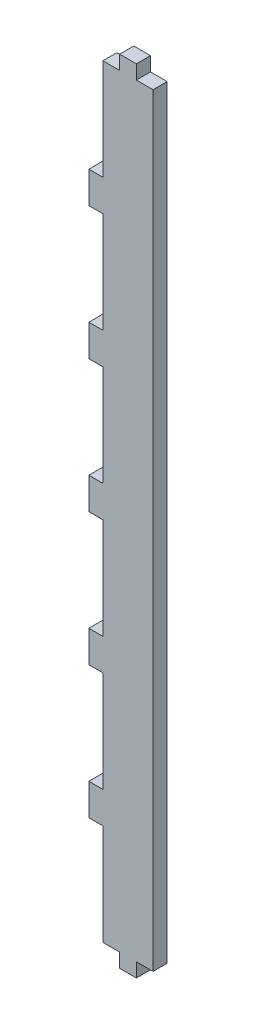
ISO-10303-21;
HEADER;
FILE_DESCRIPTION(('STEP AP214'),'2;1');
FILE_NAME('part.step','',(''),(''),'','','');
FILE_SCHEMA(('AUTOMOTIVE_DESIGN { 1 0 10303 214 1 1 1 1 }'));
ENDSEC;
DATA;
#1=APPLICATION_CONTEXT('core data for automotive mechanical design processes');
#2=APPLICATION_PROTOCOL_DEFINITION('international standard','automotive_design',2000,#1);
#3=PRODUCT_CONTEXT('',#1,'mechanical');
#4=PRODUCT('Part','Part','',(#3));
#5=PRODUCT_RELATED_PRODUCT_CATEGORY('part','',(#4));
#6=PRODUCT_DEFINITION_FORMATION('','',#4);
#7=PRODUCT_DEFINITION_CONTEXT('part definition',#1,'design');
#8=PRODUCT_DEFINITION('design','',#6,#7);
#9=PRODUCT_DEFINITION_SHAPE('','',#8);
#10=(LENGTH_UNIT() NAMED_UNIT(*) SI_UNIT(.MILLI.,.METRE.));
#11=(NAMED_UNIT(*) PLANE_ANGLE_UNIT() SI_UNIT($,.RADIAN.));
#12=(NAMED_UNIT(*) SI_UNIT($,.STERADIAN.) SOLID_ANGLE_UNIT());
#13=UNCERTAINTY_MEASURE_WITH_UNIT(LENGTH_MEASURE(1.E-05),#10,'distance_accuracy_value','');
#14=(GEOMETRIC_REPRESENTATION_CONTEXT(3) GLOBAL_UNCERTAINTY_ASSIGNED_CONTEXT((#13)) GLOBAL_UNIT_ASSIGNED_CONTEXT((#10,
#11,#12)) REPRESENTATION_CONTEXT('',''));
#15=CARTESIAN_POINT('',(0.,0.,0.));
#16=DIRECTION('',(0.,0.,1.));
#17=DIRECTION('',(1.,0.,0.));
#18=AXIS2_PLACEMENT_3D('',#15,#16,#17);
#19=CARTESIAN_POINT('',(24.4000004605,5.3499937057,5.35));
#20=DIRECTION('',(-1.,0.,0.));
#21=DIRECTION('',(0.,0.,1.));
#22=AXIS2_PLACEMENT_3D('',#19,#20,#21);
#23=PLANE('',#22);
#24=DIRECTION('',(0.,1.,0.));
#25=VECTOR('',#24,1.);
#26=CARTESIAN_POINT('',(24.4000004605,5.3499937057,0.));
#27=LINE('',#26,#25);
#28=CARTESIAN_POINT('',(24.4000004605,5.3499937057,0.));
#29=VERTEX_POINT('',#28);
#30=CARTESIAN_POINT('',(24.4000004605,295.3500039875,0.));
#31=VERTEX_POINT('',#30);
#32=EDGE_CURVE('E273',#29,#31,#27,.T.);
#33=ORIENTED_EDGE('',*,*,#32,.T.);
#34=DIRECTION('',(0.,0.,-1.));
#35=VECTOR('',#34,1.);
#36=CARTESIAN_POINT('',(24.4000004605,295.3500039875,5.35));
#37=LINE('',#36,#35);
#38=CARTESIAN_POINT('',(24.4000004605,295.3500039875,5.35));
#39=VERTEX_POINT('',#38);
#40=EDGE_CURVE('E11',#39,#31,#37,.T.);
#41=ORIENTED_EDGE('',*,*,#40,.F.);
#42=DIRECTION('',(0.,1.,0.));
#43=VECTOR('',#42,1.);
#44=CARTESIAN_POINT('',(24.4000004605,5.3499937057,5.35));
#45=LINE('',#44,#43);
#46=CARTESIAN_POINT('',(24.4000004605,5.3499937057,5.35));
#47=VERTEX_POINT('',#46);
#48=EDGE_CURVE('E335',#47,#39,#45,.T.);
#49=ORIENTED_EDGE('',*,*,#48,.F.);
#50=DIRECTION('',(0.,0.,-1.));
#51=VECTOR('',#50,1.);
#52=CARTESIAN_POINT('',(24.4000004605,5.3499937057,5.35));
#53=LINE('',#52,#51);
#54=EDGE_CURVE('E269',#47,#29,#53,.T.);
#55=ORIENTED_EDGE('',*,*,#54,.T.);
#56=EDGE_LOOP('',(#33,#41,#49,#55));
#57=FACE_BOUND('',#56,.T.);
#58=ADVANCED_FACE('F33',(#57),#23,.F.);
#59=CARTESIAN_POINT('',(24.4000004605,295.3500039875,5.35));
#60=DIRECTION('',(0.,-1.,0.));
#61=DIRECTION('',(0.,0.,-1.));
#62=AXIS2_PLACEMENT_3D('',#59,#60,#61);
#63=PLANE('',#62);
#64=DIRECTION('',(-1.,0.,0.));
#65=VECTOR('',#64,1.);
#66=CARTESIAN_POINT('',(24.4000004605,295.3500039875,0.));
#67=LINE('',#66,#65);
#68=CARTESIAN_POINT('',(18.0500000716,295.3500039875,0.));
#69=VERTEX_POINT('',#68);
#70=EDGE_CURVE('E276',#31,#69,#67,.T.);
#71=ORIENTED_EDGE('',*,*,#70,.T.);
#72=DIRECTION('',(0.,0.,-1.));
#73=VECTOR('',#72,1.);
#74=CARTESIAN_POINT('',(18.0500000716,295.3500039875,5.35));
#75=LINE('',#74,#73);
#76=CARTESIAN_POINT('',(18.0500000716,295.3500039875,5.35));
#77=VERTEX_POINT('',#76);
#78=EDGE_CURVE('E41',#77,#69,#75,.T.);
#79=ORIENTED_EDGE('',*,*,#78,.F.);
#80=DIRECTION('',(-1.,0.,0.));
#81=VECTOR('',#80,1.);
#82=CARTESIAN_POINT('',(24.4000004605,295.3500039875,5.35));
#83=LINE('',#82,#81);
#84=EDGE_CURVE('E164',#39,#77,#83,.T.);
#85=ORIENTED_EDGE('',*,*,#84,.F.);
#86=ORIENTED_EDGE('',*,*,#40,.T.);
#87=EDGE_LOOP('',(#71,#79,#85,#86));
#88=FACE_BOUND('',#87,.T.);
#89=ADVANCED_FACE('F513',(#88),#63,.F.);
#90=CARTESIAN_POINT('',(18.0500000716,295.3500039875,5.35));
#91=DIRECTION('',(-1.,0.,0.));
#92=DIRECTION('',(0.,0.,1.));
#93=AXIS2_PLACEMENT_3D('',#90,#91,#92);
#94=PLANE('',#93);
#95=DIRECTION('',(0.,1.,0.));
#96=VECTOR('',#95,1.);
#97=CARTESIAN_POINT('',(18.0500000716,295.3500039875,0.));
#98=LINE('',#97,#96);
#99=CARTESIAN_POINT('',(18.0500000716,300.7000051439,0.));
#100=VERTEX_POINT('',#99);
#101=EDGE_CURVE('E278',#69,#100,#98,.T.);
#102=ORIENTED_EDGE('',*,*,#101,.T.);
#103=DIRECTION('',(0.,0.,-1.));
#104=VECTOR('',#103,1.);
#105=CARTESIAN_POINT('',(18.0500000716,300.7000051439,5.35));
#106=LINE('',#105,#104);
#107=CARTESIAN_POINT('',(18.0500000716,300.7000051439,5.35));
#108=VERTEX_POINT('',#107);
#109=EDGE_CURVE('E414',#108,#100,#106,.T.);
#110=ORIENTED_EDGE('',*,*,#109,.F.);
#111=DIRECTION('',(0.,1.,0.));
#112=VECTOR('',#111,1.);
#113=CARTESIAN_POINT('',(18.0500000716,295.3500039875,5.35));
#114=LINE('',#113,#112);
#115=EDGE_CURVE('E422',#77,#108,#114,.T.);
#116=ORIENTED_EDGE('',*,*,#115,.F.);
#117=ORIENTED_EDGE('',*,*,#78,.T.);
#118=EDGE_LOOP('',(#102,#110,#116,#117));
#119=FACE_BOUND('',#118,.T.);
#120=ADVANCED_FACE('F420',(#119),#94,.F.);
#121=CARTESIAN_POINT('',(18.0500000716,300.7000051439,5.35));
#122=DIRECTION('',(0.,-1.,0.));
#123=DIRECTION('',(0.,0.,-1.));
#124=AXIS2_PLACEMENT_3D('',#121,#122,#123);
#125=PLANE('',#124);
#126=DIRECTION('',(-1.,0.,0.));
#127=VECTOR('',#126,1.);
#128=CARTESIAN_POINT('',(18.0500000716,300.7000051439,0.));
#129=LINE('',#128,#127);
#130=CARTESIAN_POINT('',(11.7000001483,300.7000051439,0.));
#131=VERTEX_POINT('',#130);
#132=EDGE_CURVE('E280',#100,#131,#129,.T.);
#133=ORIENTED_EDGE('',*,*,#132,.T.);
#134=DIRECTION('',(0.,0.,-1.));
#135=VECTOR('',#134,1.);
#136=CARTESIAN_POINT('',(11.7000001483,300.7000051439,5.35));
#137=LINE('',#136,#135);
#138=CARTESIAN_POINT('',(11.7000001483,300.7000051439,5.35));
#139=VERTEX_POINT('',#138);
#140=EDGE_CURVE('E411',#139,#131,#137,.T.);
#141=ORIENTED_EDGE('',*,*,#140,.F.);
#142=DIRECTION('',(-1.,0.,0.));
#143=VECTOR('',#142,1.);
#144=CARTESIAN_POINT('',(18.0500000716,300.7000051439,5.35));
#145=LINE('',#144,#143);
#146=EDGE_CURVE('E440',#108,#139,#145,.T.);
#147=ORIENTED_EDGE('',*,*,#146,.F.);
#148=ORIENTED_EDGE('',*,*,#109,.T.);
#149=EDGE_LOOP('',(#133,#141,#147,#148));
#150=FACE_BOUND('',#149,.T.);
#151=ADVANCED_FACE('F431',(#150),#125,.F.);
#152=CARTESIAN_POINT('',(11.7000001483,300.7000051439,5.35));
#153=DIRECTION('',(1.,0.,0.));
#154=DIRECTION('',(0.,0.,-1.));
#155=AXIS2_PLACEMENT_3D('',#152,#153,#154);
#156=PLANE('',#155);
#157=DIRECTION('',(0.,-1.,0.));
#158=VECTOR('',#157,1.);
#159=CARTESIAN_POINT('',(11.7000001483,300.7000051439,0.));
#160=LINE('',#159,#158);
#161=CARTESIAN_POINT('',(11.7000001483,295.3500039875,0.));
#162=VERTEX_POINT('',#161);
#163=EDGE_CURVE('E282',#131,#162,#160,.T.);
#164=ORIENTED_EDGE('',*,*,#163,.T.);
#165=DIRECTION('',(0.,0.,-1.));
#166=VECTOR('',#165,1.);
#167=CARTESIAN_POINT('',(11.7000001483,295.3500039875,5.35));
#168=LINE('',#167,#166);
#169=CARTESIAN_POINT('',(11.7000001483,295.3500039875,5.35));
#170=VERTEX_POINT('',#169);
#171=EDGE_CURVE('E408',#170,#162,#168,.T.);
#172=ORIENTED_EDGE('',*,*,#171,.F.);
#173=DIRECTION('',(0.,-1.,0.));
#174=VECTOR('',#173,1.);
#175=CARTESIAN_POINT('',(11.7000001483,300.7000051439,5.35));
#176=LINE('',#175,#174);
#177=EDGE_CURVE('E437',#139,#170,#176,.T.);
#178=ORIENTED_EDGE('',*,*,#177,.F.);
#179=ORIENTED_EDGE('',*,*,#140,.T.);
#180=EDGE_LOOP('',(#164,#172,#178,#179));
#181=FACE_BOUND('',#180,.T.);
#182=ADVANCED_FACE('F435',(#181),#156,.F.);
#183=CARTESIAN_POINT('',(11.7000001483,295.3500039875,5.35));
#184=DIRECTION('',(0.,-1.,0.));
#185=DIRECTION('',(0.,0.,-1.));
#186=AXIS2_PLACEMENT_3D('',#183,#184,#185);
#187=PLANE('',#186);
#188=DIRECTION('',(-1.,0.,0.));
#189=VECTOR('',#188,1.);
#190=CARTESIAN_POINT('',(11.7000001483,295.3500039875,0.));
#191=LINE('',#190,#189);
#192=CARTESIAN_POINT('',(5.35000022509999,295.3500039875,0.));
#193=VERTEX_POINT('',#192);
#194=EDGE_CURVE('E284',#162,#193,#191,.T.);
#195=ORIENTED_EDGE('',*,*,#194,.T.);
#196=DIRECTION('',(0.,0.,-1.));
#197=VECTOR('',#196,1.);
#198=CARTESIAN_POINT('',(5.35000022509999,295.3500039875,5.35));
#199=LINE('',#198,#197);
#200=CARTESIAN_POINT('',(5.35000022509999,295.3500039875,5.35));
#201=VERTEX_POINT('',#200);
#202=EDGE_CURVE('E405',#201,#193,#199,.T.);
#203=ORIENTED_EDGE('',*,*,#202,.F.);
#204=DIRECTION('',(-1.,0.,0.));
#205=VECTOR('',#204,1.);
#206=CARTESIAN_POINT('',(11.7000001483,295.3500039875,5.35));
#207=LINE('',#206,#205);
#208=EDGE_CURVE('E439',#170,#201,#207,.T.);
#209=ORIENTED_EDGE('',*,*,#208,.F.);
#210=ORIENTED_EDGE('',*,*,#171,.T.);
#211=EDGE_LOOP('',(#195,#203,#209,#210));
#212=FACE_BOUND('',#211,.T.);
#213=ADVANCED_FACE('F526',(#212),#187,.F.);
#214=CARTESIAN_POINT('',(5.35000022509999,295.3500039875,5.35));
#215=DIRECTION('',(1.,0.,0.));
#216=DIRECTION('',(0.,0.,-1.));
#217=AXIS2_PLACEMENT_3D('',#214,#215,#216);
#218=PLANE('',#217);
#219=DIRECTION('',(0.,-1.,0.));
#220=VECTOR('',#219,1.);
#221=CARTESIAN_POINT('',(5.35000022509999,295.3500039875,0.));
#222=LINE('',#221,#220);
#223=CARTESIAN_POINT('',(5.35000022509999,257.0166713558,0.));
#224=VERTEX_POINT('',#223);
#225=EDGE_CURVE('E286',#193,#224,#222,.T.);
#226=ORIENTED_EDGE('',*,*,#225,.T.);
#227=DIRECTION('',(0.,0.,-1.));
#228=VECTOR('',#227,1.);
#229=CARTESIAN_POINT('',(5.35000022509999,257.0166713558,5.35));
#230=LINE('',#229,#228);
#231=CARTESIAN_POINT('',(5.35000022509999,257.0166713558,5.35));
#232=VERTEX_POINT('',#231);
#233=EDGE_CURVE('E402',#232,#224,#230,.T.);
#234=ORIENTED_EDGE('',*,*,#233,.F.);
#235=DIRECTION('',(0.,-1.,0.));
#236=VECTOR('',#235,1.);
#237=CARTESIAN_POINT('',(5.35000022509999,295.3500039875,5.35));
#238=LINE('',#237,#236);
#239=EDGE_CURVE('E442',#201,#232,#238,.T.);
#240=ORIENTED_EDGE('',*,*,#239,.F.);
#241=ORIENTED_EDGE('',*,*,#202,.T.);
#242=EDGE_LOOP('',(#226,#234,#240,#241));
#243=FACE_BOUND('',#242,.T.);
#244=ADVANCED_FACE('F529',(#243),#218,.F.);
#245=CARTESIAN_POINT('',(5.35000022509999,257.0166713558,5.35));
#246=DIRECTION('',(0.,-1.,0.));
#247=DIRECTION('',(0.,0.,-1.));
#248=AXIS2_PLACEMENT_3D('',#245,#246,#247);
#249=PLANE('',#248);
#250=DIRECTION('',(-1.,0.,0.));
#251=VECTOR('',#250,1.);
#252=CARTESIAN_POINT('',(5.35000022509999,257.0166713558,0.));
#253=LINE('',#252,#251);
#254=CARTESIAN_POINT('',(0.,257.0166713558,0.));
#255=VERTEX_POINT('',#254);
#256=EDGE_CURVE('E288',#224,#255,#253,.T.);
#257=ORIENTED_EDGE('',*,*,#256,.T.);
#258=DIRECTION('',(0.,0.,-1.));
#259=VECTOR('',#258,1.);
#260=CARTESIAN_POINT('',(0.,257.0166713558,5.35));
#261=LINE('',#260,#259);
#262=CARTESIAN_POINT('',(0.,257.0166713558,5.35));
#263=VERTEX_POINT('',#262);
#264=EDGE_CURVE('E399',#263,#255,#261,.T.);
#265=ORIENTED_EDGE('',*,*,#264,.F.);
#266=DIRECTION('',(-1.,0.,0.));
#267=VECTOR('',#266,1.);
#268=CARTESIAN_POINT('',(5.35000022509999,257.0166713558,5.35));
#269=LINE('',#268,#267);
#270=EDGE_CURVE('E448',#232,#263,#269,.T.);
#271=ORIENTED_EDGE('',*,*,#270,.F.);
#272=ORIENTED_EDGE('',*,*,#233,.T.);
#273=EDGE_LOOP('',(#257,#265,#271,#272));
#274=FACE_BOUND('',#273,.T.);
#275=ADVANCED_FACE('F533',(#274),#249,.F.);
#276=CARTESIAN_POINT('',(0.,257.0166713558,5.35));
#277=DIRECTION('',(1.,0.,0.));
#278=DIRECTION('',(0.,0.,-1.));
#279=AXIS2_PLACEMENT_3D('',#276,#277,#278);
#280=PLANE('',#279);
#281=DIRECTION('',(0.,-1.,0.));
#282=VECTOR('',#281,1.);
#283=CARTESIAN_POINT('',(0.,257.0166713558,0.));
#284=LINE('',#283,#282);
#285=CARTESIAN_POINT('',(0.,245.0166717172,0.));
#286=VERTEX_POINT('',#285);
#287=EDGE_CURVE('E290',#255,#286,#284,.T.);
#288=ORIENTED_EDGE('',*,*,#287,.T.);
#289=DIRECTION('',(0.,0.,-1.));
#290=VECTOR('',#289,1.);
#291=CARTESIAN_POINT('',(0.,245.0166717172,5.35));
#292=LINE('',#291,#290);
#293=CARTESIAN_POINT('',(0.,245.0166717172,5.35));
#294=VERTEX_POINT('',#293);
#295=EDGE_CURVE('E396',#294,#286,#292,.T.);
#296=ORIENTED_EDGE('',*,*,#295,.F.);
#297=DIRECTION('',(0.,-1.,0.));
#298=VECTOR('',#297,1.);
#299=CARTESIAN_POINT('',(0.,257.0166713558,5.35));
#300=LINE('',#299,#298);
#301=EDGE_CURVE('E450',#263,#294,#300,.T.);
#302=ORIENTED_EDGE('',*,*,#301,.F.);
#303=ORIENTED_EDGE('',*,*,#264,.T.);
#304=EDGE_LOOP('',(#288,#296,#302,#303));
#305=FACE_BOUND('',#304,.T.);
#306=ADVANCED_FACE('F537',(#305),#280,.F.);
#307=CARTESIAN_POINT('',(0.,245.0166717172,5.35));
#308=DIRECTION('',(0.,1.,0.));
#309=DIRECTION('',(0.,0.,1.));
#310=AXIS2_PLACEMENT_3D('',#307,#308,#309);
#311=PLANE('',#310);
#312=DIRECTION('',(1.,0.,0.));
#313=VECTOR('',#312,1.);
#314=CARTESIAN_POINT('',(0.,245.0166717172,0.));
#315=LINE('',#314,#313);
#316=CARTESIAN_POINT('',(5.35000022509999,245.0166717172,0.));
#317=VERTEX_POINT('',#316);
#318=EDGE_CURVE('E292',#286,#317,#315,.T.);
#319=ORIENTED_EDGE('',*,*,#318,.T.);
#320=DIRECTION('',(0.,0.,-1.));
#321=VECTOR('',#320,1.);
#322=CARTESIAN_POINT('',(5.35000022509999,245.0166717172,5.35));
#323=LINE('',#322,#321);
#324=CARTESIAN_POINT('',(5.35000022509999,245.0166717172,5.35));
#325=VERTEX_POINT('',#324);
#326=EDGE_CURVE('E393',#325,#317,#323,.T.);
#327=ORIENTED_EDGE('',*,*,#326,.F.);
#328=DIRECTION('',(1.,0.,0.));
#329=VECTOR('',#328,1.);
#330=CARTESIAN_POINT('',(0.,245.0166717172,5.35));
#331=LINE('',#330,#329);
#332=EDGE_CURVE('E452',#294,#325,#331,.T.);
#333=ORIENTED_EDGE('',*,*,#332,.F.);
#334=ORIENTED_EDGE('',*,*,#295,.T.);
#335=EDGE_LOOP('',(#319,#327,#333,#334));
#336=FACE_BOUND('',#335,.T.);
#337=ADVANCED_FACE('F541',(#336),#311,.F.);
#338=CARTESIAN_POINT('',(5.35000022509999,245.0166717172,5.35));
#339=DIRECTION('',(1.,0.,0.));
#340=DIRECTION('',(0.,0.,-1.));
#341=AXIS2_PLACEMENT_3D('',#338,#339,#340);
#342=PLANE('',#341);
#343=DIRECTION('',(0.,-1.,0.));
#344=VECTOR('',#343,1.);
#345=CARTESIAN_POINT('',(5.35000022509999,245.0166717172,0.));
#346=LINE('',#345,#344);
#347=CARTESIAN_POINT('',(5.35000022509999,206.6833376884,0.));
#348=VERTEX_POINT('',#347);
#349=EDGE_CURVE('E294',#317,#348,#346,.T.);
#350=ORIENTED_EDGE('',*,*,#349,.T.);
#351=DIRECTION('',(0.,0.,-1.));
#352=VECTOR('',#351,1.);
#353=CARTESIAN_POINT('',(5.35000022509999,206.6833376884,5.35));
#354=LINE('',#353,#352);
#355=CARTESIAN_POINT('',(5.35000022509999,206.6833376884,5.35));
#356=VERTEX_POINT('',#355);
#357=EDGE_CURVE('E390',#356,#348,#354,.T.);
#358=ORIENTED_EDGE('',*,*,#357,.F.);
#359=DIRECTION('',(0.,-1.,0.));
#360=VECTOR('',#359,1.);
#361=CARTESIAN_POINT('',(5.35000022509999,245.0166717172,5.35));
#362=LINE('',#361,#360);
#363=EDGE_CURVE('E454',#325,#356,#362,.T.);
#364=ORIENTED_EDGE('',*,*,#363,.F.);
#365=ORIENTED_EDGE('',*,*,#326,.T.);
#366=EDGE_LOOP('',(#350,#358,#364,#365));
#367=FACE_BOUND('',#366,.T.);
#368=ADVANCED_FACE('F545',(#367),#342,.F.);
#369=CARTESIAN_POINT('',(5.35000022509999,206.6833376884,5.35));
#370=DIRECTION('',(0.,-1.,0.));
#371=DIRECTION('',(0.,0.,-1.));
#372=AXIS2_PLACEMENT_3D('',#369,#370,#371);
#373=PLANE('',#372);
#374=DIRECTION('',(-1.,0.,0.));
#375=VECTOR('',#374,1.);
#376=CARTESIAN_POINT('',(5.35000022509999,206.6833376884,0.));
#377=LINE('',#376,#375);
#378=CARTESIAN_POINT('',(0.,206.6833376884,0.));
#379=VERTEX_POINT('',#378);
#380=EDGE_CURVE('E296',#348,#379,#377,.T.);
#381=ORIENTED_EDGE('',*,*,#380,.T.);
#382=DIRECTION('',(0.,0.,-1.));
#383=VECTOR('',#382,1.);
#384=CARTESIAN_POINT('',(0.,206.6833376884,5.35));
#385=LINE('',#384,#383);
#386=CARTESIAN_POINT('',(0.,206.6833376884,5.35));
#387=VERTEX_POINT('',#386);
#388=EDGE_CURVE('E387',#387,#379,#385,.T.);
#389=ORIENTED_EDGE('',*,*,#388,.F.);
#390=DIRECTION('',(-1.,0.,0.));
#391=VECTOR('',#390,1.);
#392=CARTESIAN_POINT('',(5.35000022509999,206.6833376884,5.35));
#393=LINE('',#392,#391);
#394=EDGE_CURVE('E456',#356,#387,#393,.T.);
#395=ORIENTED_EDGE('',*,*,#394,.F.);
#396=ORIENTED_EDGE('',*,*,#357,.T.);
#397=EDGE_LOOP('',(#381,#389,#395,#396));
#398=FACE_BOUND('',#397,.T.);
#399=ADVANCED_FACE('F549',(#398),#373,.F.);
#400=CARTESIAN_POINT('',(0.,206.6833376884,5.35));
#401=DIRECTION('',(1.,0.,0.));
#402=DIRECTION('',(0.,0.,-1.));
#403=AXIS2_PLACEMENT_3D('',#400,#401,#402);
#404=PLANE('',#403);
#405=DIRECTION('',(0.,-1.,0.));
#406=VECTOR('',#405,1.);
#407=CARTESIAN_POINT('',(0.,206.6833376884,0.));
#408=LINE('',#407,#406);
#409=CARTESIAN_POINT('',(0.,194.6833357215,0.));
#410=VERTEX_POINT('',#409);
#411=EDGE_CURVE('E298',#379,#410,#408,.T.);
#412=ORIENTED_EDGE('',*,*,#411,.T.);
#413=DIRECTION('',(0.,0.,-1.));
#414=VECTOR('',#413,1.);
#415=CARTESIAN_POINT('',(0.,194.6833357215,5.35));
#416=LINE('',#415,#414);
#417=CARTESIAN_POINT('',(0.,194.6833357215,5.35));
#418=VERTEX_POINT('',#417);
#419=EDGE_CURVE('E384',#418,#410,#416,.T.);
#420=ORIENTED_EDGE('',*,*,#419,.F.);
#421=DIRECTION('',(0.,-1.,0.));
#422=VECTOR('',#421,1.);
#423=CARTESIAN_POINT('',(0.,206.6833376884,5.35));
#424=LINE('',#423,#422);
#425=EDGE_CURVE('E458',#387,#418,#424,.T.);
#426=ORIENTED_EDGE('',*,*,#425,.F.);
#427=ORIENTED_EDGE('',*,*,#388,.T.);
#428=EDGE_LOOP('',(#412,#420,#426,#427));
#429=FACE_BOUND('',#428,.T.);
#430=ADVANCED_FACE('F553',(#429),#404,.F.);
#431=CARTESIAN_POINT('',(0.,194.6833357215,5.35));
#432=DIRECTION('',(0.,1.,0.));
#433=DIRECTION('',(0.,0.,1.));
#434=AXIS2_PLACEMENT_3D('',#431,#432,#433);
#435=PLANE('',#434);
#436=DIRECTION('',(1.,0.,0.));
#437=VECTOR('',#436,1.);
#438=CARTESIAN_POINT('',(0.,194.6833357215,0.));
#439=LINE('',#438,#437);
#440=CARTESIAN_POINT('',(5.35000022509999,194.6833357215,0.));
#441=VERTEX_POINT('',#440);
#442=EDGE_CURVE('E300',#410,#441,#439,.T.);
#443=ORIENTED_EDGE('',*,*,#442,.T.);
#444=DIRECTION('',(0.,0.,-1.));
#445=VECTOR('',#444,1.);
#446=CARTESIAN_POINT('',(5.35000022509999,194.6833357215,5.35));
#447=LINE('',#446,#445);
#448=CARTESIAN_POINT('',(5.35000022509999,194.6833357215,5.35));
#449=VERTEX_POINT('',#448);
#450=EDGE_CURVE('E381',#449,#441,#447,.T.);
#451=ORIENTED_EDGE('',*,*,#450,.F.);
#452=DIRECTION('',(1.,0.,0.));
#453=VECTOR('',#452,1.);
#454=CARTESIAN_POINT('',(0.,194.6833357215,5.35));
#455=LINE('',#454,#453);
#456=EDGE_CURVE('E460',#418,#449,#455,.T.);
#457=ORIENTED_EDGE('',*,*,#456,.F.);
#458=ORIENTED_EDGE('',*,*,#419,.T.);
#459=EDGE_LOOP('',(#443,#451,#457,#458));
#460=FACE_BOUND('',#459,.T.);
#461=ADVANCED_FACE('F557',(#460),#435,.F.);
#462=CARTESIAN_POINT('',(5.35000022509999,194.6833357215,5.35));
#463=DIRECTION('',(1.,0.,0.));
#464=DIRECTION('',(0.,0.,-1.));
#465=AXIS2_PLACEMENT_3D('',#462,#463,#464);
#466=PLANE('',#465);
#467=DIRECTION('',(0.,-1.,0.));
#468=VECTOR('',#467,1.);
#469=CARTESIAN_POINT('',(5.35000022509999,194.6833357215,0.));
#470=LINE('',#469,#468);
#471=CARTESIAN_POINT('',(5.35000022509999,156.3500016928,0.));
#472=VERTEX_POINT('',#471);
#473=EDGE_CURVE('E302',#441,#472,#470,.T.);
#474=ORIENTED_EDGE('',*,*,#473,.T.);
#475=DIRECTION('',(0.,0.,-1.));
#476=VECTOR('',#475,1.);
#477=CARTESIAN_POINT('',(5.35000022509999,156.3500016928,5.35));
#478=LINE('',#477,#476);
#479=CARTESIAN_POINT('',(5.35000022509999,156.3500016928,5.35));
#480=VERTEX_POINT('',#479);
#481=EDGE_CURVE('E378',#480,#472,#478,.T.);
#482=ORIENTED_EDGE('',*,*,#481,.F.);
#483=DIRECTION('',(0.,-1.,0.));
#484=VECTOR('',#483,1.);
#485=CARTESIAN_POINT('',(5.35000022509999,194.6833357215,5.35));
#486=LINE('',#485,#484);
#487=EDGE_CURVE('E462',#449,#480,#486,.T.);
#488=ORIENTED_EDGE('',*,*,#487,.F.);
#489=ORIENTED_EDGE('',*,*,#450,.T.);
#490=EDGE_LOOP('',(#474,#482,#488,#489));
#491=FACE_BOUND('',#490,.T.);
#492=ADVANCED_FACE('F561',(#491),#466,.F.);
#493=CARTESIAN_POINT('',(5.35000022509999,156.3500016928,5.35));
#494=DIRECTION('',(0.,-1.,0.));
#495=DIRECTION('',(0.,0.,-1.));
#496=AXIS2_PLACEMENT_3D('',#493,#494,#495);
#497=PLANE('',#496);
#498=DIRECTION('',(-1.,0.,0.));
#499=VECTOR('',#498,1.);
#500=CARTESIAN_POINT('',(5.35000022509999,156.3500016928,0.));
#501=LINE('',#500,#499);
#502=CARTESIAN_POINT('',(0.,156.3500016928,0.));
#503=VERTEX_POINT('',#502);
#504=EDGE_CURVE('E304',#472,#503,#501,.T.);
#505=ORIENTED_EDGE('',*,*,#504,.T.);
#506=DIRECTION('',(0.,0.,-1.));
#507=VECTOR('',#506,1.);
#508=CARTESIAN_POINT('',(0.,156.3500016928,5.35));
#509=LINE('',#508,#507);
#510=CARTESIAN_POINT('',(0.,156.3500016928,5.35));
#511=VERTEX_POINT('',#510);
#512=EDGE_CURVE('E375',#511,#503,#509,.T.);
#513=ORIENTED_EDGE('',*,*,#512,.F.);
#514=DIRECTION('',(-1.,0.,0.));
#515=VECTOR('',#514,1.);
#516=CARTESIAN_POINT('',(5.35000022509999,156.3500016928,5.35));
#517=LINE('',#516,#515);
#518=EDGE_CURVE('E464',#480,#511,#517,.T.);
#519=ORIENTED_EDGE('',*,*,#518,.F.);
#520=ORIENTED_EDGE('',*,*,#481,.T.);
#521=EDGE_LOOP('',(#505,#513,#519,#520));
#522=FACE_BOUND('',#521,.T.);
#523=ADVANCED_FACE('F565',(#522),#497,.F.);
#524=CARTESIAN_POINT('',(0.,156.3500016928,5.35));
#525=DIRECTION('',(1.,0.,0.));
#526=DIRECTION('',(0.,0.,-1.));
#527=AXIS2_PLACEMENT_3D('',#524,#525,#526);
#528=PLANE('',#527);
#529=DIRECTION('',(0.,-1.,0.));
#530=VECTOR('',#529,1.);
#531=CARTESIAN_POINT('',(0.,156.3500016928,0.));
#532=LINE('',#531,#530);
#533=CARTESIAN_POINT('',(0.,144.3500071764,0.));
#534=VERTEX_POINT('',#533);
#535=EDGE_CURVE('E306',#503,#534,#532,.T.);
#536=ORIENTED_EDGE('',*,*,#535,.T.);
#537=DIRECTION('',(0.,0.,-1.));
#538=VECTOR('',#537,1.);
#539=CARTESIAN_POINT('',(0.,144.3500071764,5.35));
#540=LINE('',#539,#538);
#541=CARTESIAN_POINT('',(0.,144.3500071764,5.35));
#542=VERTEX_POINT('',#541);
#543=EDGE_CURVE('E372',#542,#534,#540,.T.);
#544=ORIENTED_EDGE('',*,*,#543,.F.);
#545=DIRECTION('',(0.,-1.,0.));
#546=VECTOR('',#545,1.);
#547=CARTESIAN_POINT('',(0.,156.3500016928,5.35));
#548=LINE('',#547,#546);
#549=EDGE_CURVE('E466',#511,#542,#548,.T.);
#550=ORIENTED_EDGE('',*,*,#549,.F.);
#551=ORIENTED_EDGE('',*,*,#512,.T.);
#552=EDGE_LOOP('',(#536,#544,#550,#551));
#553=FACE_BOUND('',#552,.T.);
#554=ADVANCED_FACE('F569',(#553),#528,.F.);
#555=CARTESIAN_POINT('',(0.,144.3500071764,5.35));
#556=DIRECTION('',(0.,1.,0.));
#557=DIRECTION('',(0.,0.,1.));
#558=AXIS2_PLACEMENT_3D('',#555,#556,#557);
#559=PLANE('',#558);
#560=DIRECTION('',(1.,0.,0.));
#561=VECTOR('',#560,1.);
#562=CARTESIAN_POINT('',(0.,144.3500071764,0.));
#563=LINE('',#562,#561);
#564=CARTESIAN_POINT('',(5.35000022509999,144.3500071764,0.));
#565=VERTEX_POINT('',#564);
#566=EDGE_CURVE('E308',#534,#565,#563,.T.);
#567=ORIENTED_EDGE('',*,*,#566,.T.);
#568=DIRECTION('',(0.,0.,-1.));
#569=VECTOR('',#568,1.);
#570=CARTESIAN_POINT('',(5.35000022509999,144.3500071764,5.35));
#571=LINE('',#570,#569);
#572=CARTESIAN_POINT('',(5.35000022509999,144.3500071764,5.35));
#573=VERTEX_POINT('',#572);
#574=EDGE_CURVE('E369',#573,#565,#571,.T.);
#575=ORIENTED_EDGE('',*,*,#574,.F.);
#576=DIRECTION('',(1.,0.,0.));
#577=VECTOR('',#576,1.);
#578=CARTESIAN_POINT('',(0.,144.3500071764,5.35));
#579=LINE('',#578,#577);
#580=EDGE_CURVE('E468',#542,#573,#579,.T.);
#581=ORIENTED_EDGE('',*,*,#580,.F.);
#582=ORIENTED_EDGE('',*,*,#543,.T.);
#583=EDGE_LOOP('',(#567,#575,#581,#582));
#584=FACE_BOUND('',#583,.T.);
#585=ADVANCED_FACE('F573',(#584),#559,.F.);
#586=CARTESIAN_POINT('',(5.35000022509999,144.3500071764,5.35));
#587=DIRECTION('',(1.,0.,0.));
#588=DIRECTION('',(0.,0.,-1.));
#589=AXIS2_PLACEMENT_3D('',#586,#587,#588);
#590=PLANE('',#589);
#591=DIRECTION('',(0.,-1.,0.));
#592=VECTOR('',#591,1.);
#593=CARTESIAN_POINT('',(5.35000022509999,144.3500071764,0.));
#594=LINE('',#593,#592);
#595=CARTESIAN_POINT('',(5.35000022509999,106.0166656971,0.));
#596=VERTEX_POINT('',#595);
#597=EDGE_CURVE('E310',#565,#596,#594,.T.);
#598=ORIENTED_EDGE('',*,*,#597,.T.);
#599=DIRECTION('',(0.,0.,-1.));
#600=VECTOR('',#599,1.);
#601=CARTESIAN_POINT('',(5.35000022509999,106.0166656971,5.35));
#602=LINE('',#601,#600);
#603=CARTESIAN_POINT('',(5.35000022509999,106.0166656971,5.35));
#604=VERTEX_POINT('',#603);
#605=EDGE_CURVE('E366',#604,#596,#602,.T.);
#606=ORIENTED_EDGE('',*,*,#605,.F.);
#607=DIRECTION('',(0.,-1.,0.));
#608=VECTOR('',#607,1.);
#609=CARTESIAN_POINT('',(5.35000022509999,144.3500071764,5.35));
#610=LINE('',#609,#608);
#611=EDGE_CURVE('E470',#573,#604,#610,.T.);
#612=ORIENTED_EDGE('',*,*,#611,.F.);
#613=ORIENTED_EDGE('',*,*,#574,.T.);
#614=EDGE_LOOP('',(#598,#606,#612,#613));
#615=FACE_BOUND('',#614,.T.);
#616=ADVANCED_FACE('F577',(#615),#590,.F.);
#617=CARTESIAN_POINT('',(5.35000022509999,106.0166656971,5.35));
#618=DIRECTION('',(0.,-1.,0.));
#619=DIRECTION('',(0.,0.,-1.));
#620=AXIS2_PLACEMENT_3D('',#617,#618,#619);
#621=PLANE('',#620);
#622=DIRECTION('',(-1.,0.,0.));
#623=VECTOR('',#622,1.);
#624=CARTESIAN_POINT('',(5.35000022509999,106.0166656971,0.));
#625=LINE('',#624,#623);
#626=CARTESIAN_POINT('',(0.,106.0166656971,0.));
#627=VERTEX_POINT('',#626);
#628=EDGE_CURVE('E312',#596,#627,#625,.T.);
#629=ORIENTED_EDGE('',*,*,#628,.T.);
#630=DIRECTION('',(0.,0.,-1.));
#631=VECTOR('',#630,1.);
#632=CARTESIAN_POINT('',(0.,106.0166656971,5.35));
#633=LINE('',#632,#631);
#634=CARTESIAN_POINT('',(0.,106.0166656971,5.35));
#635=VERTEX_POINT('',#634);
#636=EDGE_CURVE('E363',#635,#627,#633,.T.);
#637=ORIENTED_EDGE('',*,*,#636,.F.);
#638=DIRECTION('',(-1.,0.,0.));
#639=VECTOR('',#638,1.);
#640=CARTESIAN_POINT('',(5.35000022509999,106.0166656971,5.35));
#641=LINE('',#640,#639);
#642=EDGE_CURVE('E472',#604,#635,#641,.T.);
#643=ORIENTED_EDGE('',*,*,#642,.F.);
#644=ORIENTED_EDGE('',*,*,#605,.T.);
#645=EDGE_LOOP('',(#629,#637,#643,#644));
#646=FACE_BOUND('',#645,.T.);
#647=ADVANCED_FACE('F581',(#646),#621,.F.);
#648=CARTESIAN_POINT('',(0.,106.0166656971,5.35));
#649=DIRECTION('',(1.,0.,0.));
#650=DIRECTION('',(0.,0.,-1.));
#651=AXIS2_PLACEMENT_3D('',#648,#649,#650);
#652=PLANE('',#651);
#653=DIRECTION('',(0.,-1.,0.));
#654=VECTOR('',#653,1.);
#655=CARTESIAN_POINT('',(0.,106.0166656971,0.));
#656=LINE('',#655,#654);
#657=CARTESIAN_POINT('',(0.,94.0166711807,0.));
#658=VERTEX_POINT('',#657);
#659=EDGE_CURVE('E314',#627,#658,#656,.T.);
#660=ORIENTED_EDGE('',*,*,#659,.T.);
#661=DIRECTION('',(0.,0.,-1.));
#662=VECTOR('',#661,1.);
#663=CARTESIAN_POINT('',(0.,94.0166711807,5.35));
#664=LINE('',#663,#662);
#665=CARTESIAN_POINT('',(0.,94.0166711807,5.35));
#666=VERTEX_POINT('',#665);
#667=EDGE_CURVE('E360',#666,#658,#664,.T.);
#668=ORIENTED_EDGE('',*,*,#667,.F.);
#669=DIRECTION('',(0.,-1.,0.));
#670=VECTOR('',#669,1.);
#671=CARTESIAN_POINT('',(0.,106.0166656971,5.35));
#672=LINE('',#671,#670);
#673=EDGE_CURVE('E474',#635,#666,#672,.T.);
#674=ORIENTED_EDGE('',*,*,#673,.F.);
#675=ORIENTED_EDGE('',*,*,#636,.T.);
#676=EDGE_LOOP('',(#660,#668,#674,#675));
#677=FACE_BOUND('',#676,.T.);
#678=ADVANCED_FACE('F585',(#677),#652,.F.);
#679=CARTESIAN_POINT('',(0.,94.0166711807,5.35));
#680=DIRECTION('',(0.,1.,0.));
#681=DIRECTION('',(0.,0.,1.));
#682=AXIS2_PLACEMENT_3D('',#679,#680,#681);
#683=PLANE('',#682);
#684=DIRECTION('',(1.,0.,0.));
#685=VECTOR('',#684,1.);
#686=CARTESIAN_POINT('',(0.,94.0166711807,0.));
#687=LINE('',#686,#685);
#688=CARTESIAN_POINT('',(5.35000022509999,94.0166711807,0.));
#689=VERTEX_POINT('',#688);
#690=EDGE_CURVE('E316',#658,#689,#687,.T.);
#691=ORIENTED_EDGE('',*,*,#690,.T.);
#692=DIRECTION('',(0.,0.,-1.));
#693=VECTOR('',#692,1.);
#694=CARTESIAN_POINT('',(5.35000022509999,94.0166711807,5.35));
#695=LINE('',#694,#693);
#696=CARTESIAN_POINT('',(5.35000022509999,94.0166711807,5.35));
#697=VERTEX_POINT('',#696);
#698=EDGE_CURVE('E357',#697,#689,#695,.T.);
#699=ORIENTED_EDGE('',*,*,#698,.F.);
#700=DIRECTION('',(1.,0.,0.));
#701=VECTOR('',#700,1.);
#702=CARTESIAN_POINT('',(0.,94.0166711807,5.35));
#703=LINE('',#702,#701);
#704=EDGE_CURVE('E476',#666,#697,#703,.T.);
#705=ORIENTED_EDGE('',*,*,#704,.F.);
#706=ORIENTED_EDGE('',*,*,#667,.T.);
#707=EDGE_LOOP('',(#691,#699,#705,#706));
#708=FACE_BOUND('',#707,.T.);
#709=ADVANCED_FACE('F589',(#708),#683,.F.);
#710=CARTESIAN_POINT('',(5.35000022509999,94.0166711807,5.35));
#711=DIRECTION('',(1.,0.,0.));
#712=DIRECTION('',(0.,0.,-1.));
#713=AXIS2_PLACEMENT_3D('',#710,#711,#712);
#714=PLANE('',#713);
#715=DIRECTION('',(0.,-1.,0.));
#716=VECTOR('',#715,1.);
#717=CARTESIAN_POINT('',(5.35000022509999,94.0166711807,0.));
#718=LINE('',#717,#716);
#719=CARTESIAN_POINT('',(5.35000022509999,55.6833446026,0.));
#720=VERTEX_POINT('',#719);
#721=EDGE_CURVE('E318',#689,#720,#718,.T.);
#722=ORIENTED_EDGE('',*,*,#721,.T.);
#723=DIRECTION('',(0.,0.,-1.));
#724=VECTOR('',#723,1.);
#725=CARTESIAN_POINT('',(5.35000022509999,55.6833446026,5.35));
#726=LINE('',#725,#724);
#727=CARTESIAN_POINT('',(5.35000022509999,55.6833446026,5.35));
#728=VERTEX_POINT('',#727);
#729=EDGE_CURVE('E354',#728,#720,#726,.T.);
#730=ORIENTED_EDGE('',*,*,#729,.F.);
#731=DIRECTION('',(0.,-1.,0.));
#732=VECTOR('',#731,1.);
#733=CARTESIAN_POINT('',(5.35000022509999,94.0166711807,5.35));
#734=LINE('',#733,#732);
#735=EDGE_CURVE('E478',#697,#728,#734,.T.);
#736=ORIENTED_EDGE('',*,*,#735,.F.);
#737=ORIENTED_EDGE('',*,*,#698,.T.);
#738=EDGE_LOOP('',(#722,#730,#736,#737));
#739=FACE_BOUND('',#738,.T.);
#740=ADVANCED_FACE('F593',(#739),#714,.F.);
#741=CARTESIAN_POINT('',(5.35000022509999,55.6833446026,5.35));
#742=DIRECTION('',(0.,-1.,0.));
#743=DIRECTION('',(0.,0.,-1.));
#744=AXIS2_PLACEMENT_3D('',#741,#742,#743);
#745=PLANE('',#744);
#746=DIRECTION('',(-1.,0.,0.));
#747=VECTOR('',#746,1.);
#748=CARTESIAN_POINT('',(5.35000022509999,55.6833446026,0.));
#749=LINE('',#748,#747);
#750=CARTESIAN_POINT('',(0.,55.6833446026,0.));
#751=VERTEX_POINT('',#750);
#752=EDGE_CURVE('E320',#720,#751,#749,.T.);
#753=ORIENTED_EDGE('',*,*,#752,.T.);
#754=DIRECTION('',(0.,0.,-1.));
#755=VECTOR('',#754,1.);
#756=CARTESIAN_POINT('',(0.,55.6833446026,5.35));
#757=LINE('',#756,#755);
#758=CARTESIAN_POINT('',(0.,55.6833446026,5.35));
#759=VERTEX_POINT('',#758);
#760=EDGE_CURVE('E351',#759,#751,#757,.T.);
#761=ORIENTED_EDGE('',*,*,#760,.F.);
#762=DIRECTION('',(-1.,0.,0.));
#763=VECTOR('',#762,1.);
#764=CARTESIAN_POINT('',(5.35000022509999,55.6833446026,5.35));
#765=LINE('',#764,#763);
#766=EDGE_CURVE('E480',#728,#759,#765,.T.);
#767=ORIENTED_EDGE('',*,*,#766,.F.);
#768=ORIENTED_EDGE('',*,*,#729,.T.);
#769=EDGE_LOOP('',(#753,#761,#767,#768));
#770=FACE_BOUND('',#769,.T.);
#771=ADVANCED_FACE('F597',(#770),#745,.F.);
#772=CARTESIAN_POINT('',(0.,55.6833446026,5.35));
#773=DIRECTION('',(1.,0.,0.));
#774=DIRECTION('',(0.,0.,-1.));
#775=AXIS2_PLACEMENT_3D('',#772,#773,#774);
#776=PLANE('',#775);
#777=DIRECTION('',(0.,-1.,0.));
#778=VECTOR('',#777,1.);
#779=CARTESIAN_POINT('',(0.,55.6833446026,0.));
#780=LINE('',#779,#778);
#781=CARTESIAN_POINT('',(0.,43.683335185,0.));
#782=VERTEX_POINT('',#781);
#783=EDGE_CURVE('E322',#751,#782,#780,.T.);
#784=ORIENTED_EDGE('',*,*,#783,.T.);
#785=DIRECTION('',(0.,0.,-1.));
#786=VECTOR('',#785,1.);
#787=CARTESIAN_POINT('',(0.,43.683335185,5.35));
#788=LINE('',#787,#786);
#789=CARTESIAN_POINT('',(0.,43.683335185,5.35));
#790=VERTEX_POINT('',#789);
#791=EDGE_CURVE('E348',#790,#782,#788,.T.);
#792=ORIENTED_EDGE('',*,*,#791,.F.);
#793=DIRECTION('',(0.,-1.,0.));
#794=VECTOR('',#793,1.);
#795=CARTESIAN_POINT('',(0.,55.6833446026,5.35));
#796=LINE('',#795,#794);
#797=EDGE_CURVE('E482',#759,#790,#796,.T.);
#798=ORIENTED_EDGE('',*,*,#797,.F.);
#799=ORIENTED_EDGE('',*,*,#760,.T.);
#800=EDGE_LOOP('',(#784,#792,#798,#799));
#801=FACE_BOUND('',#800,.T.);
#802=ADVANCED_FACE('F601',(#801),#776,.F.);
#803=CARTESIAN_POINT('',(0.,43.683335185,5.35));
#804=DIRECTION('',(0.,1.,0.));
#805=DIRECTION('',(0.,0.,1.));
#806=AXIS2_PLACEMENT_3D('',#803,#804,#805);
#807=PLANE('',#806);
#808=DIRECTION('',(1.,0.,0.));
#809=VECTOR('',#808,1.);
#810=CARTESIAN_POINT('',(0.,43.683335185,0.));
#811=LINE('',#810,#809);
#812=CARTESIAN_POINT('',(5.35000022509999,43.683335185,0.));
#813=VERTEX_POINT('',#812);
#814=EDGE_CURVE('E324',#782,#813,#811,.T.);
#815=ORIENTED_EDGE('',*,*,#814,.T.);
#816=DIRECTION('',(0.,0.,-1.));
#817=VECTOR('',#816,1.);
#818=CARTESIAN_POINT('',(5.35000022509999,43.683335185,5.35));
#819=LINE('',#818,#817);
#820=CARTESIAN_POINT('',(5.35000022509999,43.683335185,5.35));
#821=VERTEX_POINT('',#820);
#822=EDGE_CURVE('E345',#821,#813,#819,.T.);
#823=ORIENTED_EDGE('',*,*,#822,.F.);
#824=DIRECTION('',(1.,0.,0.));
#825=VECTOR('',#824,1.);
#826=CARTESIAN_POINT('',(0.,43.683335185,5.35));
#827=LINE('',#826,#825);
#828=EDGE_CURVE('E484',#790,#821,#827,.T.);
#829=ORIENTED_EDGE('',*,*,#828,.F.);
#830=ORIENTED_EDGE('',*,*,#791,.T.);
#831=EDGE_LOOP('',(#815,#823,#829,#830));
#832=FACE_BOUND('',#831,.T.);
#833=ADVANCED_FACE('F605',(#832),#807,.F.);
#834=CARTESIAN_POINT('',(5.35000022509999,43.683335185,5.35));
#835=DIRECTION('',(1.,0.,0.));
#836=DIRECTION('',(0.,0.,-1.));
#837=AXIS2_PLACEMENT_3D('',#834,#835,#836);
#838=PLANE('',#837);
#839=DIRECTION('',(0.,-1.,0.));
#840=VECTOR('',#839,1.);
#841=CARTESIAN_POINT('',(5.35000022509999,43.683335185,0.));
#842=LINE('',#841,#840);
#843=CARTESIAN_POINT('',(5.35000022509999,5.3499937057,0.));
#844=VERTEX_POINT('',#843);
#845=EDGE_CURVE('E326',#813,#844,#842,.T.);
#846=ORIENTED_EDGE('',*,*,#845,.T.);
#847=DIRECTION('',(0.,0.,-1.));
#848=VECTOR('',#847,1.);
#849=CARTESIAN_POINT('',(5.35000022509999,5.3499937057,5.35));
#850=LINE('',#849,#848);
#851=CARTESIAN_POINT('',(5.35000022509999,5.3499937057,5.35));
#852=VERTEX_POINT('',#851);
#853=EDGE_CURVE('E342',#852,#844,#850,.T.);
#854=ORIENTED_EDGE('',*,*,#853,.F.);
#855=DIRECTION('',(0.,-1.,0.));
#856=VECTOR('',#855,1.);
#857=CARTESIAN_POINT('',(5.35000022509999,43.683335185,5.35));
#858=LINE('',#857,#856);
#859=EDGE_CURVE('E486',#821,#852,#858,.T.);
#860=ORIENTED_EDGE('',*,*,#859,.F.);
#861=ORIENTED_EDGE('',*,*,#822,.T.);
#862=EDGE_LOOP('',(#846,#854,#860,#861));
#863=FACE_BOUND('',#862,.T.);
#864=ADVANCED_FACE('F609',(#863),#838,.F.);
#865=CARTESIAN_POINT('',(5.35000022509999,5.3499937057,5.35));
#866=DIRECTION('',(0.,1.,0.));
#867=DIRECTION('',(0.,0.,1.));
#868=AXIS2_PLACEMENT_3D('',#865,#866,#867);
#869=PLANE('',#868);
#870=DIRECTION('',(1.,0.,0.));
#871=VECTOR('',#870,1.);
#872=CARTESIAN_POINT('',(5.35000022509999,5.3499937057,0.));
#873=LINE('',#872,#871);
#874=CARTESIAN_POINT('',(11.7000001483,5.3499937057,0.));
#875=VERTEX_POINT('',#874);
#876=EDGE_CURVE('E328',#844,#875,#873,.T.);
#877=ORIENTED_EDGE('',*,*,#876,.T.);
#878=DIRECTION('',(0.,0.,-1.));
#879=VECTOR('',#878,1.);
#880=CARTESIAN_POINT('',(11.7000001483,5.3499937057,5.35));
#881=LINE('',#880,#879);
#882=CARTESIAN_POINT('',(11.7000001483,5.3499937057,5.35));
#883=VERTEX_POINT('',#882);
#884=EDGE_CURVE('E339',#883,#875,#881,.T.);
#885=ORIENTED_EDGE('',*,*,#884,.F.);
#886=DIRECTION('',(1.,0.,0.));
#887=VECTOR('',#886,1.);
#888=CARTESIAN_POINT('',(5.35000022509999,5.3499937057,5.35));
#889=LINE('',#888,#887);
#890=EDGE_CURVE('E488',#852,#883,#889,.T.);
#891=ORIENTED_EDGE('',*,*,#890,.F.);
#892=ORIENTED_EDGE('',*,*,#853,.T.);
#893=EDGE_LOOP('',(#877,#885,#891,#892));
#894=FACE_BOUND('',#893,.T.);
#895=ADVANCED_FACE('F494',(#894),#869,.F.);
#896=CARTESIAN_POINT('',(11.7000001483,5.3499937057,5.35));
#897=DIRECTION('',(1.,0.,0.));
#898=DIRECTION('',(0.,0.,-1.));
#899=AXIS2_PLACEMENT_3D('',#896,#897,#898);
#900=PLANE('',#899);
#901=DIRECTION('',(0.,-1.,0.));
#902=VECTOR('',#901,1.);
#903=CARTESIAN_POINT('',(11.7000001483,5.3499937057,0.));
#904=LINE('',#903,#902);
#905=CARTESIAN_POINT('',(11.7000001483,0.,0.));
#906=VERTEX_POINT('',#905);
#907=EDGE_CURVE('E330',#875,#906,#904,.T.);
#908=ORIENTED_EDGE('',*,*,#907,.T.);
#909=DIRECTION('',(0.,0.,-1.));
#910=VECTOR('',#909,1.);
#911=CARTESIAN_POINT('',(11.7000001483,0.,5.35));
#912=LINE('',#911,#910);
#913=CARTESIAN_POINT('',(11.7000001483,0.,5.35));
#914=VERTEX_POINT('',#913);
#915=EDGE_CURVE('E264',#914,#906,#912,.T.);
#916=ORIENTED_EDGE('',*,*,#915,.F.);
#917=DIRECTION('',(0.,-1.,0.));
#918=VECTOR('',#917,1.);
#919=CARTESIAN_POINT('',(11.7000001483,5.3499937057,5.35));
#920=LINE('',#919,#918);
#921=EDGE_CURVE('E255',#883,#914,#920,.T.);
#922=ORIENTED_EDGE('',*,*,#921,.F.);
#923=ORIENTED_EDGE('',*,*,#884,.T.);
#924=EDGE_LOOP('',(#908,#916,#922,#923));
#925=FACE_BOUND('',#924,.T.);
#926=ADVANCED_FACE('F498',(#925),#900,.F.);
#927=CARTESIAN_POINT('',(11.7000001483,0.,5.35));
#928=DIRECTION('',(0.,1.,0.));
#929=DIRECTION('',(0.,0.,1.));
#930=AXIS2_PLACEMENT_3D('',#927,#928,#929);
#931=PLANE('',#930);
#932=DIRECTION('',(1.,0.,0.));
#933=VECTOR('',#932,1.);
#934=CARTESIAN_POINT('',(11.7000001483,0.,0.));
#935=LINE('',#934,#933);
#936=CARTESIAN_POINT('',(18.0500000716,0.,0.));
#937=VERTEX_POINT('',#936);
#938=EDGE_CURVE('E263',#906,#937,#935,.T.);
#939=ORIENTED_EDGE('',*,*,#938,.T.);
#940=DIRECTION('',(0.,0.,-1.));
#941=VECTOR('',#940,1.);
#942=CARTESIAN_POINT('',(18.0500000716,0.,5.35));
#943=LINE('',#942,#941);
#944=CARTESIAN_POINT('',(18.0500000716,0.,5.35));
#945=VERTEX_POINT('',#944);
#946=EDGE_CURVE('E260',#945,#937,#943,.T.);
#947=ORIENTED_EDGE('',*,*,#946,.F.);
#948=DIRECTION('',(1.,0.,0.));
#949=VECTOR('',#948,1.);
#950=CARTESIAN_POINT('',(11.7000001483,0.,5.35));
#951=LINE('',#950,#949);
#952=EDGE_CURVE('E249',#914,#945,#951,.T.);
#953=ORIENTED_EDGE('',*,*,#952,.F.);
#954=ORIENTED_EDGE('',*,*,#915,.T.);
#955=EDGE_LOOP('',(#939,#947,#953,#954));
#956=FACE_BOUND('',#955,.T.);
#957=ADVANCED_FACE('F261',(#956),#931,.F.);
#958=CARTESIAN_POINT('',(18.0500000716,0.,5.35));
#959=DIRECTION('',(-1.,0.,0.));
#960=DIRECTION('',(0.,0.,1.));
#961=AXIS2_PLACEMENT_3D('',#958,#959,#960);
#962=PLANE('',#961);
#963=DIRECTION('',(0.,1.,0.));
#964=VECTOR('',#963,1.);
#965=CARTESIAN_POINT('',(18.0500000716,0.,0.));
#966=LINE('',#965,#964);
#967=CARTESIAN_POINT('',(18.0500000716,5.3499937057,0.));
#968=VERTEX_POINT('',#967);
#969=EDGE_CURVE('E150',#937,#968,#966,.T.);
#970=ORIENTED_EDGE('',*,*,#969,.T.);
#971=DIRECTION('',(0.,0.,-1.));
#972=VECTOR('',#971,1.);
#973=CARTESIAN_POINT('',(18.0500000716,5.3499937057,5.35));
#974=LINE('',#973,#972);
#975=CARTESIAN_POINT('',(18.0500000716,5.3499937057,5.35));
#976=VERTEX_POINT('',#975);
#977=EDGE_CURVE('E265',#976,#968,#974,.T.);
#978=ORIENTED_EDGE('',*,*,#977,.F.);
#979=DIRECTION('',(0.,1.,0.));
#980=VECTOR('',#979,1.);
#981=CARTESIAN_POINT('',(18.0500000716,0.,5.35));
#982=LINE('',#981,#980);
#983=EDGE_CURVE('E253',#945,#976,#982,.T.);
#984=ORIENTED_EDGE('',*,*,#983,.F.);
#985=ORIENTED_EDGE('',*,*,#946,.T.);
#986=EDGE_LOOP('',(#970,#978,#984,#985));
#987=FACE_BOUND('',#986,.T.);
#988=ADVANCED_FACE('F267',(#987),#962,.F.);
#989=CARTESIAN_POINT('',(18.0500000716,5.3499937057,5.35));
#990=DIRECTION('',(0.,1.,0.));
#991=DIRECTION('',(0.,0.,1.));
#992=AXIS2_PLACEMENT_3D('',#989,#990,#991);
#993=PLANE('',#992);
#994=DIRECTION('',(1.,0.,0.));
#995=VECTOR('',#994,1.);
#996=CARTESIAN_POINT('',(18.0500000716,5.3499937057,0.));
#997=LINE('',#996,#995);
#998=EDGE_CURVE('E156',#968,#29,#997,.T.);
#999=ORIENTED_EDGE('',*,*,#998,.T.);
#1000=ORIENTED_EDGE('',*,*,#54,.F.);
#1001=DIRECTION('',(1.,0.,0.));
#1002=VECTOR('',#1001,1.);
#1003=CARTESIAN_POINT('',(18.0500000716,5.3499937057,5.35));
#1004=LINE('',#1003,#1002);
#1005=EDGE_CURVE('E49',#976,#47,#1004,.T.);
#1006=ORIENTED_EDGE('',*,*,#1005,.F.);
#1007=ORIENTED_EDGE('',*,*,#977,.T.);
#1008=EDGE_LOOP('',(#999,#1000,#1006,#1007));
#1009=FACE_BOUND('',#1008,.T.);
#1010=ADVANCED_FACE('F502',(#1009),#993,.F.);
#1011=CARTESIAN_POINT('',(0.,0.,5.35));
#1012=DIRECTION('',(0.,0.,1.));
#1013=DIRECTION('',(1.,0.,0.));
#1014=AXIS2_PLACEMENT_3D('',#1011,#1012,#1013);
#1015=PLANE('',#1014);
#1016=ORIENTED_EDGE('',*,*,#48,.T.);
#1017=ORIENTED_EDGE('',*,*,#84,.T.);
#1018=ORIENTED_EDGE('',*,*,#115,.T.);
#1019=ORIENTED_EDGE('',*,*,#146,.T.);
#1020=ORIENTED_EDGE('',*,*,#177,.T.);
#1021=ORIENTED_EDGE('',*,*,#208,.T.);
#1022=ORIENTED_EDGE('',*,*,#239,.T.);
#1023=ORIENTED_EDGE('',*,*,#270,.T.);
#1024=ORIENTED_EDGE('',*,*,#301,.T.);
#1025=ORIENTED_EDGE('',*,*,#332,.T.);
#1026=ORIENTED_EDGE('',*,*,#363,.T.);
#1027=ORIENTED_EDGE('',*,*,#394,.T.);
#1028=ORIENTED_EDGE('',*,*,#425,.T.);
#1029=ORIENTED_EDGE('',*,*,#456,.T.);
#1030=ORIENTED_EDGE('',*,*,#487,.T.);
#1031=ORIENTED_EDGE('',*,*,#518,.T.);
#1032=ORIENTED_EDGE('',*,*,#549,.T.);
#1033=ORIENTED_EDGE('',*,*,#580,.T.);
#1034=ORIENTED_EDGE('',*,*,#611,.T.);
#1035=ORIENTED_EDGE('',*,*,#642,.T.);
#1036=ORIENTED_EDGE('',*,*,#673,.T.);
#1037=ORIENTED_EDGE('',*,*,#704,.T.);
#1038=ORIENTED_EDGE('',*,*,#735,.T.);
#1039=ORIENTED_EDGE('',*,*,#766,.T.);
#1040=ORIENTED_EDGE('',*,*,#797,.T.);
#1041=ORIENTED_EDGE('',*,*,#828,.T.);
#1042=ORIENTED_EDGE('',*,*,#859,.T.);
#1043=ORIENTED_EDGE('',*,*,#890,.T.);
#1044=ORIENTED_EDGE('',*,*,#921,.T.);
#1045=ORIENTED_EDGE('',*,*,#952,.T.);
#1046=ORIENTED_EDGE('',*,*,#983,.T.);
#1047=ORIENTED_EDGE('',*,*,#1005,.T.);
#1048=EDGE_LOOP('',(#1016,#1017,#1018,#1019,#1020,#1021,#1022,#1023,#1024,#1025,#1026,#1027,
#1028,#1029,#1030,#1031,#1032,#1033,#1034,#1035,#1036,#1037,#1038,#1039,#1040,#1041,#1042,#1043,
#1044,#1045,#1046,#1047));
#1049=FACE_BOUND('',#1048,.T.);
#1050=ADVANCED_FACE('F251',(#1049),#1015,.T.);
#1051=CARTESIAN_POINT('',(0.,0.,0.));
#1052=DIRECTION('',(0.,0.,1.));
#1053=DIRECTION('',(1.,0.,0.));
#1054=AXIS2_PLACEMENT_3D('',#1051,#1052,#1053);
#1055=PLANE('',#1054);
#1056=ORIENTED_EDGE('',*,*,#32,.F.);
#1057=ORIENTED_EDGE('',*,*,#998,.F.);
#1058=ORIENTED_EDGE('',*,*,#969,.F.);
#1059=ORIENTED_EDGE('',*,*,#938,.F.);
#1060=ORIENTED_EDGE('',*,*,#907,.F.);
#1061=ORIENTED_EDGE('',*,*,#876,.F.);
#1062=ORIENTED_EDGE('',*,*,#845,.F.);
#1063=ORIENTED_EDGE('',*,*,#814,.F.);
#1064=ORIENTED_EDGE('',*,*,#783,.F.);
#1065=ORIENTED_EDGE('',*,*,#752,.F.);
#1066=ORIENTED_EDGE('',*,*,#721,.F.);
#1067=ORIENTED_EDGE('',*,*,#690,.F.);
#1068=ORIENTED_EDGE('',*,*,#659,.F.);
#1069=ORIENTED_EDGE('',*,*,#628,.F.);
#1070=ORIENTED_EDGE('',*,*,#597,.F.);
#1071=ORIENTED_EDGE('',*,*,#566,.F.);
#1072=ORIENTED_EDGE('',*,*,#535,.F.);
#1073=ORIENTED_EDGE('',*,*,#504,.F.);
#1074=ORIENTED_EDGE('',*,*,#473,.F.);
#1075=ORIENTED_EDGE('',*,*,#442,.F.);
#1076=ORIENTED_EDGE('',*,*,#411,.F.);
#1077=ORIENTED_EDGE('',*,*,#380,.F.);
#1078=ORIENTED_EDGE('',*,*,#349,.F.);
#1079=ORIENTED_EDGE('',*,*,#318,.F.);
#1080=ORIENTED_EDGE('',*,*,#287,.F.);
#1081=ORIENTED_EDGE('',*,*,#256,.F.);
#1082=ORIENTED_EDGE('',*,*,#225,.F.);
#1083=ORIENTED_EDGE('',*,*,#194,.F.);
#1084=ORIENTED_EDGE('',*,*,#163,.F.);
#1085=ORIENTED_EDGE('',*,*,#132,.F.);
#1086=ORIENTED_EDGE('',*,*,#101,.F.);
#1087=ORIENTED_EDGE('',*,*,#70,.F.);
#1088=EDGE_LOOP('',(#1056,#1057,#1058,#1059,#1060,#1061,#1062,#1063,#1064,#1065,#1066,#1067,
#1068,#1069,#1070,#1071,#1072,#1073,#1074,#1075,#1076,#1077,#1078,#1079,#1080,#1081,#1082,#1083,
#1084,#1085,#1086,#1087));
#1089=FACE_BOUND('',#1088,.T.);
#1090=ADVANCED_FACE('F426',(#1089),#1055,.F.);
#1091=CLOSED_SHELL('',(#58,#89,#120,#151,#182,#213,#244,#275,#306,#337,#368,#399,#430,#461,#492,
#523,#554,#585,#616,#647,#678,#709,#740,#771,#802,#833,#864,#895,#926,#957,#988,#1010,#1050,#1090));
#1092=MANIFOLD_SOLID_BREP('B2',#1091);
#1093=ADVANCED_BREP_SHAPE_REPRESENTATION('',(#18,#1092),#14);
#1094=SHAPE_DEFINITION_REPRESENTATION(#9,#1093);
ENDSEC;
END-ISO-10303-21;
